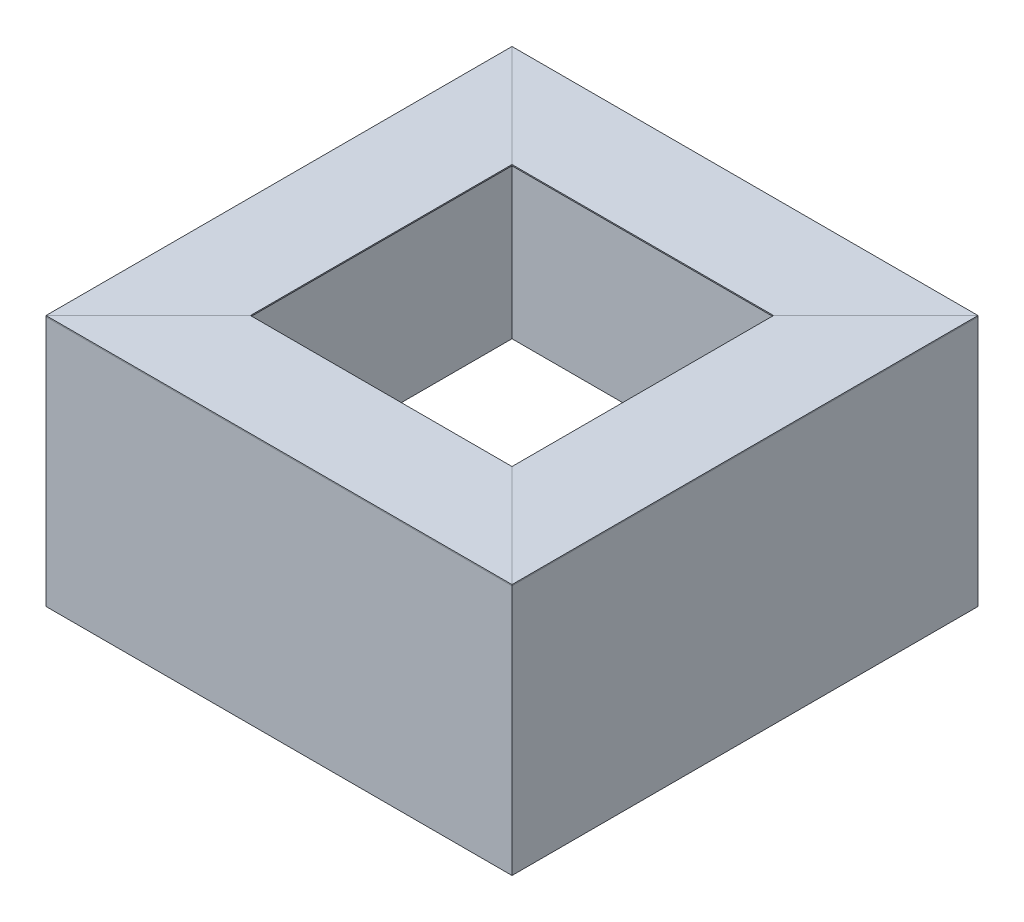
ISO-10303-21;
HEADER;
FILE_DESCRIPTION(('STEP AP214'),'2;1');
FILE_NAME('part.step','',(''),(''),'','','');
FILE_SCHEMA(('AUTOMOTIVE_DESIGN { 1 0 10303 214 1 1 1 1 }'));
ENDSEC;
DATA;
#1=APPLICATION_CONTEXT('core data for automotive mechanical design processes');
#2=APPLICATION_PROTOCOL_DEFINITION('international standard','automotive_design',2000,#1);
#3=PRODUCT_CONTEXT('',#1,'mechanical');
#4=PRODUCT('Part','Part','',(#3));
#5=PRODUCT_RELATED_PRODUCT_CATEGORY('part','',(#4));
#6=PRODUCT_DEFINITION_FORMATION('','',#4);
#7=PRODUCT_DEFINITION_CONTEXT('part definition',#1,'design');
#8=PRODUCT_DEFINITION('design','',#6,#7);
#9=PRODUCT_DEFINITION_SHAPE('','',#8);
#10=(LENGTH_UNIT() NAMED_UNIT(*) SI_UNIT(.MILLI.,.METRE.));
#11=(NAMED_UNIT(*) PLANE_ANGLE_UNIT() SI_UNIT($,.RADIAN.));
#12=(NAMED_UNIT(*) SI_UNIT($,.STERADIAN.) SOLID_ANGLE_UNIT());
#13=UNCERTAINTY_MEASURE_WITH_UNIT(LENGTH_MEASURE(1.E-05),#10,'distance_accuracy_value','');
#14=(GEOMETRIC_REPRESENTATION_CONTEXT(3) GLOBAL_UNCERTAINTY_ASSIGNED_CONTEXT((#13)) GLOBAL_UNIT_ASSIGNED_CONTEXT((#10,
#11,#12)) REPRESENTATION_CONTEXT('',''));
#15=CARTESIAN_POINT('',(0.,0.,0.));
#16=DIRECTION('',(0.,0.,1.));
#17=DIRECTION('',(1.,0.,0.));
#18=AXIS2_PLACEMENT_3D('',#15,#16,#17);
#19=CARTESIAN_POINT('',(189.353415021333,618.40840285693,-50.052741345654));
#20=DIRECTION('',(0.,0.,1.));
#21=DIRECTION('',(1.,0.,0.));
#22=AXIS2_PLACEMENT_3D('',#19,#20,#21);
#23=PLANE('',#22);
#24=DIRECTION('',(1.,0.,0.));
#25=VECTOR('',#24,1.);
#26=CARTESIAN_POINT('',(4.35341502133302,717.787955627811,-50.052741345654));
#27=LINE('',#26,#25);
#28=CARTESIAN_POINT('',(5.10541502133299,717.787955627811,-50.052741345654));
#29=VERTEX_POINT('',#28);
#30=CARTESIAN_POINT('',(374.353415021333,717.787955627811,-50.052741345654));
#31=VERTEX_POINT('',#30);
#32=EDGE_CURVE('E120',#29,#31,#27,.T.);
#33=ORIENTED_EDGE('',*,*,#32,.F.);
#34=DIRECTION('',(0.,-1.,0.));
#35=VECTOR('',#34,1.);
#36=CARTESIAN_POINT('',(5.10541502133299,618.40840285693,-50.052741345654));
#37=LINE('',#36,#35);
#38=CARTESIAN_POINT('',(5.10541502133299,519.028850086049,-50.052741345654));
#39=VERTEX_POINT('',#38);
#40=EDGE_CURVE('E59',#29,#39,#37,.T.);
#41=ORIENTED_EDGE('',*,*,#40,.T.);
#42=DIRECTION('',(-1.,0.,0.));
#43=VECTOR('',#42,1.);
#44=CARTESIAN_POINT('',(374.353415021333,519.028850086049,-50.052741345654));
#45=LINE('',#44,#43);
#46=CARTESIAN_POINT('',(374.353415021333,519.028850086049,-50.052741345654));
#47=VERTEX_POINT('',#46);
#48=EDGE_CURVE('E147',#47,#39,#45,.T.);
#49=ORIENTED_EDGE('',*,*,#48,.F.);
#50=DIRECTION('',(0.,1.,0.));
#51=VECTOR('',#50,1.);
#52=CARTESIAN_POINT('',(374.353415021333,618.40840285693,-50.052741345654));
#53=LINE('',#52,#51);
#54=EDGE_CURVE('E12',#47,#31,#53,.T.);
#55=ORIENTED_EDGE('',*,*,#54,.T.);
#56=EDGE_LOOP('',(#33,#41,#49,#55));
#57=FACE_BOUND('',#56,.T.);
#58=ADVANCED_FACE('F49',(#57),#23,.T.);
#59=CARTESIAN_POINT('',(5.108415021333,717.787955627811,-50.965741345654));
#60=DIRECTION('',(0.,0.,-1.));
#61=DIRECTION('',(0.,1.,0.));
#62=AXIS2_PLACEMENT_3D('',#59,#60,#61);
#63=PLANE('',#62);
#64=DIRECTION('',(0.,-1.,0.));
#65=VECTOR('',#64,1.);
#66=CARTESIAN_POINT('',(373.440415021333,668.098179242371,-50.965741345654));
#67=LINE('',#66,#65);
#68=CARTESIAN_POINT('',(373.440415021333,717.787955627811,-50.965741345654));
#69=VERTEX_POINT('',#68);
#70=CARTESIAN_POINT('',(373.440415021333,519.028850086049,-50.965741345654));
#71=VERTEX_POINT('',#70);
#72=EDGE_CURVE('E149',#69,#71,#67,.T.);
#73=ORIENTED_EDGE('',*,*,#72,.T.);
#74=DIRECTION('',(-1.,0.,0.));
#75=VECTOR('',#74,1.);
#76=CARTESIAN_POINT('',(5.108415021333,519.028850086049,-50.965741345654));
#77=LINE('',#76,#75);
#78=CARTESIAN_POINT('',(6.01841502133302,519.028850086049,-50.965741345654));
#79=VERTEX_POINT('',#78);
#80=EDGE_CURVE('E124',#71,#79,#77,.T.);
#81=ORIENTED_EDGE('',*,*,#80,.T.);
#82=DIRECTION('',(0.,-1.,0.));
#83=VECTOR('',#82,1.);
#84=CARTESIAN_POINT('',(6.01841502133302,668.098179242371,-50.965741345654));
#85=LINE('',#84,#83);
#86=CARTESIAN_POINT('',(6.01841502133302,717.787955627811,-50.965741345654));
#87=VERTEX_POINT('',#86);
#88=EDGE_CURVE('E123',#87,#79,#85,.T.);
#89=ORIENTED_EDGE('',*,*,#88,.F.);
#90=DIRECTION('',(-1.,0.,0.));
#91=VECTOR('',#90,1.);
#92=CARTESIAN_POINT('',(5.108415021333,717.787955627811,-50.965741345654));
#93=LINE('',#92,#91);
#94=EDGE_CURVE('E108',#69,#87,#93,.T.);
#95=ORIENTED_EDGE('',*,*,#94,.F.);
#96=EDGE_LOOP('',(#73,#81,#89,#95));
#97=FACE_BOUND('',#96,.T.);
#98=ADVANCED_FACE('F51',(#97),#63,.T.);
#99=CARTESIAN_POINT('',(374.353415021333,717.787955627811,-50.052741345653));
#100=DIRECTION('',(1.,0.,0.));
#101=DIRECTION('',(0.,-1.,0.));
#102=AXIS2_PLACEMENT_3D('',#99,#100,#101);
#103=PLANE('',#102);
#104=DIRECTION('',(0.,0.,-1.));
#105=VECTOR('',#104,1.);
#106=CARTESIAN_POINT('',(374.353415021333,519.028850086049,-50.052741345654));
#107=LINE('',#106,#105);
#108=CARTESIAN_POINT('',(374.353415021333,519.028850086049,-419.300741345654));
#109=VERTEX_POINT('',#108);
#110=EDGE_CURVE('E141',#47,#109,#107,.T.);
#111=ORIENTED_EDGE('',*,*,#110,.T.);
#112=DIRECTION('',(0.,1.,0.));
#113=VECTOR('',#112,1.);
#114=CARTESIAN_POINT('',(374.353415021333,519.028850086049,-419.300741345654));
#115=LINE('',#114,#113);
#116=CARTESIAN_POINT('',(374.353415021333,717.787955627811,-419.300741345654));
#117=VERTEX_POINT('',#116);
#118=EDGE_CURVE('E133',#109,#117,#115,.T.);
#119=ORIENTED_EDGE('',*,*,#118,.T.);
#120=DIRECTION('',(0.,0.,-1.));
#121=VECTOR('',#120,1.);
#122=CARTESIAN_POINT('',(374.353415021333,717.787955627811,-50.052741345653));
#123=LINE('',#122,#121);
#124=EDGE_CURVE('E154',#31,#117,#123,.T.);
#125=ORIENTED_EDGE('',*,*,#124,.F.);
#126=ORIENTED_EDGE('',*,*,#54,.F.);
#127=EDGE_LOOP('',(#111,#119,#125,#126));
#128=FACE_BOUND('',#127,.T.);
#129=ADVANCED_FACE('F203',(#128),#103,.T.);
#130=CARTESIAN_POINT('',(5.10541502133299,618.40840285693,-234.675741345654));
#131=DIRECTION('',(-1.,0.,0.));
#132=DIRECTION('',(0.,0.,1.));
#133=AXIS2_PLACEMENT_3D('',#130,#131,#132);
#134=PLANE('',#133);
#135=DIRECTION('',(0.,0.,-1.));
#136=VECTOR('',#135,1.);
#137=CARTESIAN_POINT('',(5.10541502133299,519.028850086049,-419.299741345654));
#138=LINE('',#137,#136);
#139=CARTESIAN_POINT('',(5.10541502133299,519.028850086049,-419.300741345654));
#140=VERTEX_POINT('',#139);
#141=EDGE_CURVE('E146',#39,#140,#138,.T.);
#142=ORIENTED_EDGE('',*,*,#141,.F.);
#143=ORIENTED_EDGE('',*,*,#40,.F.);
#144=DIRECTION('',(0.,0.,1.));
#145=VECTOR('',#144,1.);
#146=CARTESIAN_POINT('',(5.10541502133299,717.787955627811,-50.053741345654));
#147=LINE('',#146,#145);
#148=CARTESIAN_POINT('',(5.10541502133299,717.787955627811,-419.300741345654));
#149=VERTEX_POINT('',#148);
#150=EDGE_CURVE('E155',#149,#29,#147,.T.);
#151=ORIENTED_EDGE('',*,*,#150,.F.);
#152=DIRECTION('',(0.,1.,0.));
#153=VECTOR('',#152,1.);
#154=CARTESIAN_POINT('',(5.10541502133299,618.40840285693,-419.300741345654));
#155=LINE('',#154,#153);
#156=EDGE_CURVE('E153',#140,#149,#155,.T.);
#157=ORIENTED_EDGE('',*,*,#156,.F.);
#158=EDGE_LOOP('',(#142,#143,#151,#157));
#159=FACE_BOUND('',#158,.T.);
#160=ADVANCED_FACE('F209',(#159),#134,.T.);
#161=CARTESIAN_POINT('',(5.10541502133299,717.787955627811,-419.675741345654));
#162=DIRECTION('',(0.,1.,0.));
#163=DIRECTION('',(0.,0.,-1.));
#164=AXIS2_PLACEMENT_3D('',#161,#162,#163);
#165=PLANE('',#164);
#166=ORIENTED_EDGE('',*,*,#94,.T.);
#167=DIRECTION('',(0.,0.,1.));
#168=VECTOR('',#167,1.);
#169=CARTESIAN_POINT('',(6.01841502133302,717.787955627811,-419.675741345654));
#170=LINE('',#169,#168);
#171=CARTESIAN_POINT('',(6.01841502133302,717.787955627811,-418.387741345654));
#172=VERTEX_POINT('',#171);
#173=EDGE_CURVE('E113',#172,#87,#170,.T.);
#174=ORIENTED_EDGE('',*,*,#173,.F.);
#175=DIRECTION('',(-1.,0.,0.));
#176=VECTOR('',#175,1.);
#177=CARTESIAN_POINT('',(5.10641502133299,717.787955627811,-418.387741345654));
#178=LINE('',#177,#176);
#179=CARTESIAN_POINT('',(373.440415021333,717.787955627811,-418.387741345654));
#180=VERTEX_POINT('',#179);
#181=EDGE_CURVE('E166',#180,#172,#178,.T.);
#182=ORIENTED_EDGE('',*,*,#181,.F.);
#183=DIRECTION('',(0.,0.,-1.));
#184=VECTOR('',#183,1.);
#185=CARTESIAN_POINT('',(373.440415021333,717.787955627811,-49.675741345654));
#186=LINE('',#185,#184);
#187=EDGE_CURVE('E116',#69,#180,#186,.T.);
#188=ORIENTED_EDGE('',*,*,#187,.F.);
#189=EDGE_LOOP('',(#166,#174,#182,#188));
#190=FACE_BOUND('',#189,.T.);
#191=ORIENTED_EDGE('',*,*,#124,.T.);
#192=DIRECTION('',(-1.,0.,0.));
#193=VECTOR('',#192,1.);
#194=CARTESIAN_POINT('',(374.353415021333,717.787955627811,-419.300741345654));
#195=LINE('',#194,#193);
#196=EDGE_CURVE('E136',#117,#149,#195,.T.);
#197=ORIENTED_EDGE('',*,*,#196,.T.);
#198=ORIENTED_EDGE('',*,*,#150,.T.);
#199=ORIENTED_EDGE('',*,*,#32,.T.);
#200=EDGE_LOOP('',(#191,#197,#198,#199));
#201=FACE_BOUND('',#200,.T.);
#202=ADVANCED_FACE('F110',(#190,#201),#165,.T.);
#203=CARTESIAN_POINT('',(5.10541502133299,519.028850086049,-49.675741345654));
#204=DIRECTION('',(0.,-1.,0.));
#205=DIRECTION('',(0.,0.,-1.));
#206=AXIS2_PLACEMENT_3D('',#203,#204,#205);
#207=PLANE('',#206);
#208=DIRECTION('',(0.,0.,1.));
#209=VECTOR('',#208,1.);
#210=CARTESIAN_POINT('',(373.440415021333,519.028850086049,-419.675741345654));
#211=LINE('',#210,#209);
#212=CARTESIAN_POINT('',(373.440415021333,519.028850086049,-418.387741345654));
#213=VERTEX_POINT('',#212);
#214=EDGE_CURVE('E145',#213,#71,#211,.T.);
#215=ORIENTED_EDGE('',*,*,#214,.F.);
#216=DIRECTION('',(-1.,0.,0.));
#217=VECTOR('',#216,1.);
#218=CARTESIAN_POINT('',(5.10641502133299,519.028850086049,-418.387741345654));
#219=LINE('',#218,#217);
#220=CARTESIAN_POINT('',(6.01841502133302,519.028850086049,-418.387741345654));
#221=VERTEX_POINT('',#220);
#222=EDGE_CURVE('E53',#213,#221,#219,.T.);
#223=ORIENTED_EDGE('',*,*,#222,.T.);
#224=DIRECTION('',(0.,0.,-1.));
#225=VECTOR('',#224,1.);
#226=CARTESIAN_POINT('',(6.01841502133302,519.028850086049,-49.675741345654));
#227=LINE('',#226,#225);
#228=EDGE_CURVE('E127',#79,#221,#227,.T.);
#229=ORIENTED_EDGE('',*,*,#228,.F.);
#230=ORIENTED_EDGE('',*,*,#80,.F.);
#231=EDGE_LOOP('',(#215,#223,#229,#230));
#232=FACE_BOUND('',#231,.T.);
#233=ORIENTED_EDGE('',*,*,#110,.F.);
#234=ORIENTED_EDGE('',*,*,#48,.T.);
#235=ORIENTED_EDGE('',*,*,#141,.T.);
#236=DIRECTION('',(1.,0.,0.));
#237=VECTOR('',#236,1.);
#238=CARTESIAN_POINT('',(4.35341502133302,519.028850086049,-419.300741345654));
#239=LINE('',#238,#237);
#240=EDGE_CURVE('E164',#140,#109,#239,.T.);
#241=ORIENTED_EDGE('',*,*,#240,.T.);
#242=EDGE_LOOP('',(#233,#234,#235,#241));
#243=FACE_BOUND('',#242,.T.);
#244=ADVANCED_FACE('F180',(#232,#243),#207,.T.);
#245=CARTESIAN_POINT('',(6.01841502133302,618.40840285693,-234.675741345654));
#246=DIRECTION('',(1.,0.,0.));
#247=DIRECTION('',(0.,0.,1.));
#248=AXIS2_PLACEMENT_3D('',#245,#246,#247);
#249=PLANE('',#248);
#250=DIRECTION('',(0.,1.,0.));
#251=VECTOR('',#250,1.);
#252=CARTESIAN_POINT('',(6.01841502133302,568.718626471489,-418.387741345654));
#253=LINE('',#252,#251);
#254=EDGE_CURVE('E132',#221,#172,#253,.T.);
#255=ORIENTED_EDGE('',*,*,#254,.T.);
#256=ORIENTED_EDGE('',*,*,#173,.T.);
#257=ORIENTED_EDGE('',*,*,#88,.T.);
#258=ORIENTED_EDGE('',*,*,#228,.T.);
#259=EDGE_LOOP('',(#255,#256,#257,#258));
#260=FACE_BOUND('',#259,.T.);
#261=ADVANCED_FACE('F130',(#260),#249,.T.);
#262=CARTESIAN_POINT('',(189.353415021333,618.40840285693,-419.300741345654));
#263=DIRECTION('',(0.,0.,-1.));
#264=DIRECTION('',(0.,1.,0.));
#265=AXIS2_PLACEMENT_3D('',#262,#263,#264);
#266=PLANE('',#265);
#267=ORIENTED_EDGE('',*,*,#240,.F.);
#268=ORIENTED_EDGE('',*,*,#156,.T.);
#269=ORIENTED_EDGE('',*,*,#196,.F.);
#270=ORIENTED_EDGE('',*,*,#118,.F.);
#271=EDGE_LOOP('',(#267,#268,#269,#270));
#272=FACE_BOUND('',#271,.T.);
#273=ADVANCED_FACE('F186',(#272),#266,.T.);
#274=CARTESIAN_POINT('',(5.10641502133299,519.028850086049,-418.387741345654));
#275=DIRECTION('',(0.,0.,1.));
#276=DIRECTION('',(0.,1.,0.));
#277=AXIS2_PLACEMENT_3D('',#274,#275,#276);
#278=PLANE('',#277);
#279=ORIENTED_EDGE('',*,*,#254,.F.);
#280=ORIENTED_EDGE('',*,*,#222,.F.);
#281=DIRECTION('',(0.,1.,0.));
#282=VECTOR('',#281,1.);
#283=CARTESIAN_POINT('',(373.440415021333,568.718626471489,-418.387741345654));
#284=LINE('',#283,#282);
#285=EDGE_CURVE('E142',#213,#180,#284,.T.);
#286=ORIENTED_EDGE('',*,*,#285,.T.);
#287=ORIENTED_EDGE('',*,*,#181,.T.);
#288=EDGE_LOOP('',(#279,#280,#286,#287));
#289=FACE_BOUND('',#288,.T.);
#290=ADVANCED_FACE('F183',(#289),#278,.T.);
#291=CARTESIAN_POINT('',(373.440415021333,618.40840285693,-234.675741345654));
#292=DIRECTION('',(-1.,0.,0.));
#293=DIRECTION('',(0.,-1.,0.));
#294=AXIS2_PLACEMENT_3D('',#291,#292,#293);
#295=PLANE('',#294);
#296=ORIENTED_EDGE('',*,*,#72,.F.);
#297=ORIENTED_EDGE('',*,*,#187,.T.);
#298=ORIENTED_EDGE('',*,*,#285,.F.);
#299=ORIENTED_EDGE('',*,*,#214,.T.);
#300=EDGE_LOOP('',(#296,#297,#298,#299));
#301=FACE_BOUND('',#300,.T.);
#302=ADVANCED_FACE('F185',(#301),#295,.T.);
#303=CLOSED_SHELL('',(#58,#98,#129,#160,#202,#244,#261,#273,#290,#302));
#304=MANIFOLD_SOLID_BREP('B2',#303);
#305=CARTESIAN_POINT('',(189.729415021334,717.787955627811,-378.800741345652));
#306=DIRECTION('',(0.,-1.,0.));
#307=DIRECTION('',(0.,0.,1.));
#308=AXIS2_PLACEMENT_3D('',#305,#306,#307);
#309=PLANE('',#308);
#310=DIRECTION('',(1.,0.,0.));
#311=VECTOR('',#310,1.);
#312=CARTESIAN_POINT('',(374.353415021334,717.787955627811,-419.300741345652));
#313=LINE('',#312,#311);
#314=CARTESIAN_POINT('',(5.10541502133399,717.787955627811,-419.300741345652));
#315=VERTEX_POINT('',#314);
#316=CARTESIAN_POINT('',(374.353415021334,717.787955627811,-419.300741345652));
#317=VERTEX_POINT('',#316);
#318=EDGE_CURVE('E47',#315,#317,#313,.T.);
#319=ORIENTED_EDGE('',*,*,#318,.T.);
#320=DIRECTION('',(-0.707106781186548,0.,0.707106781186548));
#321=VECTOR('',#320,1.);
#322=CARTESIAN_POINT('',(374.353415021334,717.787955627811,-419.300741345652));
#323=LINE('',#322,#321);
#324=CARTESIAN_POINT('',(293.353415021334,717.787955627811,-338.300741345652));
#325=VERTEX_POINT('',#324);
#326=EDGE_CURVE('E353',#317,#325,#323,.T.);
#327=ORIENTED_EDGE('',*,*,#326,.T.);
#328=DIRECTION('',(-1.,0.,0.));
#329=VECTOR('',#328,1.);
#330=CARTESIAN_POINT('',(86.105415021334,717.787955627811,-338.300741345652));
#331=LINE('',#330,#329);
#332=CARTESIAN_POINT('',(86.105415021334,717.787955627811,-338.300741345652));
#333=VERTEX_POINT('',#332);
#334=EDGE_CURVE('E292',#325,#333,#331,.T.);
#335=ORIENTED_EDGE('',*,*,#334,.T.);
#336=DIRECTION('',(-0.707106781186548,0.,-0.707106781186547));
#337=VECTOR('',#336,1.);
#338=CARTESIAN_POINT('',(5.10541502133399,717.787955627811,-419.300741345652));
#339=LINE('',#338,#337);
#340=EDGE_CURVE('E343',#333,#315,#339,.T.);
#341=ORIENTED_EDGE('',*,*,#340,.T.);
#342=EDGE_LOOP('',(#319,#327,#335,#341));
#343=FACE_BOUND('',#342,.T.);
#344=ADVANCED_FACE('F288',(#343),#309,.T.);
#345=CARTESIAN_POINT('',(189.729415021334,718.700955627811,-378.800741345652));
#346=DIRECTION('',(0.,1.,0.));
#347=DIRECTION('',(-1.,0.,0.));
#348=AXIS2_PLACEMENT_3D('',#345,#346,#347);
#349=PLANE('',#348);
#350=DIRECTION('',(-1.,0.,0.));
#351=VECTOR('',#350,1.);
#352=CARTESIAN_POINT('',(374.353415021334,718.700955627811,-419.300741345652));
#353=LINE('',#352,#351);
#354=CARTESIAN_POINT('',(374.353415021334,718.700955627811,-419.300741345652));
#355=VERTEX_POINT('',#354);
#356=CARTESIAN_POINT('',(5.10541502133399,718.700955627811,-419.300741345652));
#357=VERTEX_POINT('',#356);
#358=EDGE_CURVE('E298',#355,#357,#353,.T.);
#359=ORIENTED_EDGE('',*,*,#358,.T.);
#360=DIRECTION('',(0.707106781186548,0.,0.707106781186547));
#361=VECTOR('',#360,1.);
#362=CARTESIAN_POINT('',(5.10541502133399,718.700955627811,-419.300741345652));
#363=LINE('',#362,#361);
#364=CARTESIAN_POINT('',(86.105415021334,718.700955627811,-338.300741345652));
#365=VERTEX_POINT('',#364);
#366=EDGE_CURVE('E342',#357,#365,#363,.T.);
#367=ORIENTED_EDGE('',*,*,#366,.T.);
#368=DIRECTION('',(1.,0.,0.));
#369=VECTOR('',#368,1.);
#370=CARTESIAN_POINT('',(86.105415021334,718.700955627811,-338.300741345652));
#371=LINE('',#370,#369);
#372=CARTESIAN_POINT('',(293.353415021334,718.700955627811,-338.300741345652));
#373=VERTEX_POINT('',#372);
#374=EDGE_CURVE('E327',#365,#373,#371,.T.);
#375=ORIENTED_EDGE('',*,*,#374,.T.);
#376=DIRECTION('',(-0.707106781186548,0.,0.707106781186548));
#377=VECTOR('',#376,1.);
#378=CARTESIAN_POINT('',(374.353415021334,718.700955627811,-419.300741345652));
#379=LINE('',#378,#377);
#380=EDGE_CURVE('E351',#355,#373,#379,.T.);
#381=ORIENTED_EDGE('',*,*,#380,.F.);
#382=EDGE_LOOP('',(#359,#367,#375,#381));
#383=FACE_BOUND('',#382,.T.);
#384=ADVANCED_FACE('F345',(#383),#349,.T.);
#385=CARTESIAN_POINT('',(5.10541502133399,718.700955627811,-419.300741345652));
#386=DIRECTION('',(0.,0.,-1.));
#387=DIRECTION('',(-1.,0.,0.));
#388=AXIS2_PLACEMENT_3D('',#385,#386,#387);
#389=PLANE('',#388);
#390=ORIENTED_EDGE('',*,*,#358,.F.);
#391=DIRECTION('',(0.,-1.,0.));
#392=VECTOR('',#391,1.);
#393=CARTESIAN_POINT('',(374.353415021334,718.700955627811,-419.300741345652));
#394=LINE('',#393,#392);
#395=EDGE_CURVE('E355',#355,#317,#394,.T.);
#396=ORIENTED_EDGE('',*,*,#395,.T.);
#397=ORIENTED_EDGE('',*,*,#318,.F.);
#398=DIRECTION('',(0.,-1.,0.));
#399=VECTOR('',#398,1.);
#400=CARTESIAN_POINT('',(5.10541502133399,718.700955627811,-419.300741345652));
#401=LINE('',#400,#399);
#402=EDGE_CURVE('E346',#357,#315,#401,.T.);
#403=ORIENTED_EDGE('',*,*,#402,.F.);
#404=EDGE_LOOP('',(#390,#396,#397,#403));
#405=FACE_BOUND('',#404,.T.);
#406=ADVANCED_FACE('F360',(#405),#389,.T.);
#407=CARTESIAN_POINT('',(374.353415021334,718.700955627811,-419.300741345652));
#408=DIRECTION('',(0.707106781186548,0.,0.707106781186548));
#409=DIRECTION('',(0.707106781186548,0.,-0.707106781186548));
#410=AXIS2_PLACEMENT_3D('',#407,#408,#409);
#411=PLANE('',#410);
#412=ORIENTED_EDGE('',*,*,#380,.T.);
#413=DIRECTION('',(0.,-1.,0.));
#414=VECTOR('',#413,1.);
#415=CARTESIAN_POINT('',(293.353415021334,718.700955627811,-338.300741345652));
#416=LINE('',#415,#414);
#417=EDGE_CURVE('E334',#373,#325,#416,.T.);
#418=ORIENTED_EDGE('',*,*,#417,.T.);
#419=ORIENTED_EDGE('',*,*,#326,.F.);
#420=ORIENTED_EDGE('',*,*,#395,.F.);
#421=EDGE_LOOP('',(#412,#418,#419,#420));
#422=FACE_BOUND('',#421,.T.);
#423=ADVANCED_FACE('F362',(#422),#411,.T.);
#424=CARTESIAN_POINT('',(293.353415021334,718.700955627811,-338.300741345652));
#425=DIRECTION('',(0.,0.,1.));
#426=DIRECTION('',(0.,-1.,0.));
#427=AXIS2_PLACEMENT_3D('',#424,#425,#426);
#428=PLANE('',#427);
#429=ORIENTED_EDGE('',*,*,#374,.F.);
#430=DIRECTION('',(0.,-1.,0.));
#431=VECTOR('',#430,1.);
#432=CARTESIAN_POINT('',(86.105415021334,718.700955627811,-338.300741345652));
#433=LINE('',#432,#431);
#434=EDGE_CURVE('E331',#365,#333,#433,.T.);
#435=ORIENTED_EDGE('',*,*,#434,.T.);
#436=ORIENTED_EDGE('',*,*,#334,.F.);
#437=ORIENTED_EDGE('',*,*,#417,.F.);
#438=EDGE_LOOP('',(#429,#435,#436,#437));
#439=FACE_BOUND('',#438,.T.);
#440=ADVANCED_FACE('F329',(#439),#428,.T.);
#441=CARTESIAN_POINT('',(86.105415021334,718.700955627811,-338.300741345652));
#442=DIRECTION('',(-0.707106781186547,0.,0.707106781186548));
#443=DIRECTION('',(0.,-1.,0.));
#444=AXIS2_PLACEMENT_3D('',#441,#442,#443);
#445=PLANE('',#444);
#446=ORIENTED_EDGE('',*,*,#366,.F.);
#447=ORIENTED_EDGE('',*,*,#402,.T.);
#448=ORIENTED_EDGE('',*,*,#340,.F.);
#449=ORIENTED_EDGE('',*,*,#434,.F.);
#450=EDGE_LOOP('',(#446,#447,#448,#449));
#451=FACE_BOUND('',#450,.T.);
#452=ADVANCED_FACE('F290',(#451),#445,.T.);
#453=CLOSED_SHELL('',(#344,#384,#406,#423,#440,#452));
#454=MANIFOLD_SOLID_BREP('B6',#453);
#455=CARTESIAN_POINT('',(45.605415021333,718.700955627811,-234.676741345654));
#456=DIRECTION('',(0.,1.,0.));
#457=DIRECTION('',(1.,0.,0.));
#458=AXIS2_PLACEMENT_3D('',#455,#456,#457);
#459=PLANE('',#458);
#460=DIRECTION('',(0.,0.,1.));
#461=VECTOR('',#460,1.);
#462=CARTESIAN_POINT('',(5.105415021333,718.700955627811,-50.052741345654));
#463=LINE('',#462,#461);
#464=CARTESIAN_POINT('',(5.105415021333,718.700955627811,-419.300741345654));
#465=VERTEX_POINT('',#464);
#466=CARTESIAN_POINT('',(5.105415021333,718.700955627811,-50.052741345654));
#467=VERTEX_POINT('',#466);
#468=EDGE_CURVE('E286',#465,#467,#463,.T.);
#469=ORIENTED_EDGE('',*,*,#468,.T.);
#470=DIRECTION('',(0.707106781186548,0.,-0.707106781186548));
#471=VECTOR('',#470,1.);
#472=CARTESIAN_POINT('',(5.105415021333,718.700955627811,-50.052741345654));
#473=LINE('',#472,#471);
#474=CARTESIAN_POINT('',(86.105415021333,718.700955627811,-131.052741345654));
#475=VERTEX_POINT('',#474);
#476=EDGE_CURVE('E486',#467,#475,#473,.T.);
#477=ORIENTED_EDGE('',*,*,#476,.T.);
#478=DIRECTION('',(0.,0.,-1.));
#479=VECTOR('',#478,1.);
#480=CARTESIAN_POINT('',(86.105415021333,718.700955627811,-338.300741345654));
#481=LINE('',#480,#479);
#482=CARTESIAN_POINT('',(86.105415021333,718.700955627811,-338.300741345654));
#483=VERTEX_POINT('',#482);
#484=EDGE_CURVE('E425',#475,#483,#481,.T.);
#485=ORIENTED_EDGE('',*,*,#484,.T.);
#486=DIRECTION('',(-0.707106781186547,0.,-0.707106781186548));
#487=VECTOR('',#486,1.);
#488=CARTESIAN_POINT('',(5.105415021333,718.700955627811,-419.300741345654));
#489=LINE('',#488,#487);
#490=EDGE_CURVE('E476',#483,#465,#489,.T.);
#491=ORIENTED_EDGE('',*,*,#490,.T.);
#492=EDGE_LOOP('',(#469,#477,#485,#491));
#493=FACE_BOUND('',#492,.T.);
#494=ADVANCED_FACE('F421',(#493),#459,.T.);
#495=CARTESIAN_POINT('',(45.605415021333,717.787955627811,-234.676741345654));
#496=DIRECTION('',(0.,-1.,0.));
#497=DIRECTION('',(0.,0.,-1.));
#498=AXIS2_PLACEMENT_3D('',#495,#496,#497);
#499=PLANE('',#498);
#500=DIRECTION('',(0.,0.,-1.));
#501=VECTOR('',#500,1.);
#502=CARTESIAN_POINT('',(5.105415021333,717.787955627811,-50.052741345654));
#503=LINE('',#502,#501);
#504=CARTESIAN_POINT('',(5.105415021333,717.787955627811,-50.052741345654));
#505=VERTEX_POINT('',#504);
#506=CARTESIAN_POINT('',(5.105415021333,717.787955627811,-419.300741345654));
#507=VERTEX_POINT('',#506);
#508=EDGE_CURVE('E431',#505,#507,#503,.T.);
#509=ORIENTED_EDGE('',*,*,#508,.T.);
#510=DIRECTION('',(0.707106781186547,0.,0.707106781186548));
#511=VECTOR('',#510,1.);
#512=CARTESIAN_POINT('',(5.105415021333,717.787955627811,-419.300741345654));
#513=LINE('',#512,#511);
#514=CARTESIAN_POINT('',(86.105415021333,717.787955627811,-338.300741345654));
#515=VERTEX_POINT('',#514);
#516=EDGE_CURVE('E475',#507,#515,#513,.T.);
#517=ORIENTED_EDGE('',*,*,#516,.T.);
#518=DIRECTION('',(0.,0.,1.));
#519=VECTOR('',#518,1.);
#520=CARTESIAN_POINT('',(86.105415021333,717.787955627811,-338.300741345654));
#521=LINE('',#520,#519);
#522=CARTESIAN_POINT('',(86.105415021333,717.787955627811,-131.052741345654));
#523=VERTEX_POINT('',#522);
#524=EDGE_CURVE('E460',#515,#523,#521,.T.);
#525=ORIENTED_EDGE('',*,*,#524,.T.);
#526=DIRECTION('',(0.707106781186548,0.,-0.707106781186548));
#527=VECTOR('',#526,1.);
#528=CARTESIAN_POINT('',(5.105415021333,717.787955627811,-50.052741345654));
#529=LINE('',#528,#527);
#530=EDGE_CURVE('E484',#505,#523,#529,.T.);
#531=ORIENTED_EDGE('',*,*,#530,.F.);
#532=EDGE_LOOP('',(#509,#517,#525,#531));
#533=FACE_BOUND('',#532,.T.);
#534=ADVANCED_FACE('F478',(#533),#499,.T.);
#535=CARTESIAN_POINT('',(5.105415021333,717.787955627811,-419.300741345654));
#536=DIRECTION('',(-1.,0.,0.));
#537=DIRECTION('',(0.,0.,-1.));
#538=AXIS2_PLACEMENT_3D('',#535,#536,#537);
#539=PLANE('',#538);
#540=ORIENTED_EDGE('',*,*,#508,.F.);
#541=DIRECTION('',(0.,1.,0.));
#542=VECTOR('',#541,1.);
#543=CARTESIAN_POINT('',(5.105415021333,717.787955627811,-50.052741345654));
#544=LINE('',#543,#542);
#545=EDGE_CURVE('E488',#505,#467,#544,.T.);
#546=ORIENTED_EDGE('',*,*,#545,.T.);
#547=ORIENTED_EDGE('',*,*,#468,.F.);
#548=DIRECTION('',(0.,1.,0.));
#549=VECTOR('',#548,1.);
#550=CARTESIAN_POINT('',(5.105415021333,717.787955627811,-419.300741345654));
#551=LINE('',#550,#549);
#552=EDGE_CURVE('E479',#507,#465,#551,.T.);
#553=ORIENTED_EDGE('',*,*,#552,.F.);
#554=EDGE_LOOP('',(#540,#546,#547,#553));
#555=FACE_BOUND('',#554,.T.);
#556=ADVANCED_FACE('F493',(#555),#539,.T.);
#557=CARTESIAN_POINT('',(5.105415021333,717.787955627811,-50.052741345654));
#558=DIRECTION('',(0.707106781186548,0.,0.707106781186548));
#559=DIRECTION('',(-0.707106781186548,0.,0.707106781186548));
#560=AXIS2_PLACEMENT_3D('',#557,#558,#559);
#561=PLANE('',#560);
#562=ORIENTED_EDGE('',*,*,#530,.T.);
#563=DIRECTION('',(0.,1.,0.));
#564=VECTOR('',#563,1.);
#565=CARTESIAN_POINT('',(86.105415021333,717.787955627811,-131.052741345654));
#566=LINE('',#565,#564);
#567=EDGE_CURVE('E467',#523,#475,#566,.T.);
#568=ORIENTED_EDGE('',*,*,#567,.T.);
#569=ORIENTED_EDGE('',*,*,#476,.F.);
#570=ORIENTED_EDGE('',*,*,#545,.F.);
#571=EDGE_LOOP('',(#562,#568,#569,#570));
#572=FACE_BOUND('',#571,.T.);
#573=ADVANCED_FACE('F495',(#572),#561,.T.);
#574=CARTESIAN_POINT('',(86.105415021333,717.787955627811,-131.052741345654));
#575=DIRECTION('',(1.,0.,0.));
#576=DIRECTION('',(0.,1.,0.));
#577=AXIS2_PLACEMENT_3D('',#574,#575,#576);
#578=PLANE('',#577);
#579=ORIENTED_EDGE('',*,*,#524,.F.);
#580=DIRECTION('',(0.,1.,0.));
#581=VECTOR('',#580,1.);
#582=CARTESIAN_POINT('',(86.105415021333,717.787955627811,-338.300741345654));
#583=LINE('',#582,#581);
#584=EDGE_CURVE('E464',#515,#483,#583,.T.);
#585=ORIENTED_EDGE('',*,*,#584,.T.);
#586=ORIENTED_EDGE('',*,*,#484,.F.);
#587=ORIENTED_EDGE('',*,*,#567,.F.);
#588=EDGE_LOOP('',(#579,#585,#586,#587));
#589=FACE_BOUND('',#588,.T.);
#590=ADVANCED_FACE('F462',(#589),#578,.T.);
#591=CARTESIAN_POINT('',(86.105415021333,717.787955627811,-338.300741345654));
#592=DIRECTION('',(0.707106781186548,0.,-0.707106781186547));
#593=DIRECTION('',(0.,1.,0.));
#594=AXIS2_PLACEMENT_3D('',#591,#592,#593);
#595=PLANE('',#594);
#596=ORIENTED_EDGE('',*,*,#516,.F.);
#597=ORIENTED_EDGE('',*,*,#552,.T.);
#598=ORIENTED_EDGE('',*,*,#490,.F.);
#599=ORIENTED_EDGE('',*,*,#584,.F.);
#600=EDGE_LOOP('',(#596,#597,#598,#599));
#601=FACE_BOUND('',#600,.T.);
#602=ADVANCED_FACE('F423',(#601),#595,.T.);
#603=CLOSED_SHELL('',(#494,#534,#556,#573,#590,#602));
#604=MANIFOLD_SOLID_BREP('B41',#603);
#605=CARTESIAN_POINT('',(189.729415021332,717.787955627811,-90.552741345655));
#606=DIRECTION('',(0.,-1.,0.));
#607=DIRECTION('',(0.,0.,-1.));
#608=AXIS2_PLACEMENT_3D('',#605,#606,#607);
#609=PLANE('',#608);
#610=DIRECTION('',(-1.,0.,0.));
#611=VECTOR('',#610,1.);
#612=CARTESIAN_POINT('',(5.105415021332,717.787955627811,-50.052741345655));
#613=LINE('',#612,#611);
#614=CARTESIAN_POINT('',(374.353415021332,717.787955627811,-50.052741345655));
#615=VERTEX_POINT('',#614);
#616=CARTESIAN_POINT('',(5.105415021332,717.787955627811,-50.052741345655));
#617=VERTEX_POINT('',#616);
#618=EDGE_CURVE('E419',#615,#617,#613,.T.);
#619=ORIENTED_EDGE('',*,*,#618,.T.);
#620=DIRECTION('',(0.707106781186548,0.,-0.707106781186548));
#621=VECTOR('',#620,1.);
#622=CARTESIAN_POINT('',(5.105415021332,717.787955627811,-50.052741345655));
#623=LINE('',#622,#621);
#624=CARTESIAN_POINT('',(86.105415021332,717.787955627811,-131.052741345655));
#625=VERTEX_POINT('',#624);
#626=EDGE_CURVE('E618',#617,#625,#623,.T.);
#627=ORIENTED_EDGE('',*,*,#626,.T.);
#628=DIRECTION('',(1.,0.,0.));
#629=VECTOR('',#628,1.);
#630=CARTESIAN_POINT('',(293.353415021332,717.787955627811,-131.052741345655));
#631=LINE('',#630,#629);
#632=CARTESIAN_POINT('',(293.353415021332,717.787955627811,-131.052741345655));
#633=VERTEX_POINT('',#632);
#634=EDGE_CURVE('E557',#625,#633,#631,.T.);
#635=ORIENTED_EDGE('',*,*,#634,.T.);
#636=DIRECTION('',(0.707106781186548,0.,0.707106781186547));
#637=VECTOR('',#636,1.);
#638=CARTESIAN_POINT('',(374.353415021332,717.787955627811,-50.052741345655));
#639=LINE('',#638,#637);
#640=EDGE_CURVE('E608',#633,#615,#639,.T.);
#641=ORIENTED_EDGE('',*,*,#640,.T.);
#642=EDGE_LOOP('',(#619,#627,#635,#641));
#643=FACE_BOUND('',#642,.T.);
#644=ADVANCED_FACE('F553',(#643),#609,.T.);
#645=CARTESIAN_POINT('',(189.729415021332,718.700955627811,-90.552741345655));
#646=DIRECTION('',(0.,1.,0.));
#647=DIRECTION('',(1.,0.,0.));
#648=AXIS2_PLACEMENT_3D('',#645,#646,#647);
#649=PLANE('',#648);
#650=DIRECTION('',(1.,0.,0.));
#651=VECTOR('',#650,1.);
#652=CARTESIAN_POINT('',(5.105415021332,718.700955627811,-50.052741345655));
#653=LINE('',#652,#651);
#654=CARTESIAN_POINT('',(5.105415021332,718.700955627811,-50.052741345655));
#655=VERTEX_POINT('',#654);
#656=CARTESIAN_POINT('',(374.353415021332,718.700955627811,-50.052741345655));
#657=VERTEX_POINT('',#656);
#658=EDGE_CURVE('E563',#655,#657,#653,.T.);
#659=ORIENTED_EDGE('',*,*,#658,.T.);
#660=DIRECTION('',(-0.707106781186548,0.,-0.707106781186547));
#661=VECTOR('',#660,1.);
#662=CARTESIAN_POINT('',(374.353415021332,718.700955627811,-50.052741345655));
#663=LINE('',#662,#661);
#664=CARTESIAN_POINT('',(293.353415021332,718.700955627811,-131.052741345655));
#665=VERTEX_POINT('',#664);
#666=EDGE_CURVE('E607',#657,#665,#663,.T.);
#667=ORIENTED_EDGE('',*,*,#666,.T.);
#668=DIRECTION('',(-1.,0.,0.));
#669=VECTOR('',#668,1.);
#670=CARTESIAN_POINT('',(293.353415021332,718.700955627811,-131.052741345655));
#671=LINE('',#670,#669);
#672=CARTESIAN_POINT('',(86.105415021332,718.700955627811,-131.052741345655));
#673=VERTEX_POINT('',#672);
#674=EDGE_CURVE('E592',#665,#673,#671,.T.);
#675=ORIENTED_EDGE('',*,*,#674,.T.);
#676=DIRECTION('',(0.707106781186548,0.,-0.707106781186548));
#677=VECTOR('',#676,1.);
#678=CARTESIAN_POINT('',(5.105415021332,718.700955627811,-50.052741345655));
#679=LINE('',#678,#677);
#680=EDGE_CURVE('E616',#655,#673,#679,.T.);
#681=ORIENTED_EDGE('',*,*,#680,.F.);
#682=EDGE_LOOP('',(#659,#667,#675,#681));
#683=FACE_BOUND('',#682,.T.);
#684=ADVANCED_FACE('F610',(#683),#649,.T.);
#685=CARTESIAN_POINT('',(374.353415021332,718.700955627811,-50.052741345655));
#686=DIRECTION('',(0.,0.,1.));
#687=DIRECTION('',(1.,0.,0.));
#688=AXIS2_PLACEMENT_3D('',#685,#686,#687);
#689=PLANE('',#688);
#690=ORIENTED_EDGE('',*,*,#658,.F.);
#691=DIRECTION('',(0.,-1.,0.));
#692=VECTOR('',#691,1.);
#693=CARTESIAN_POINT('',(5.105415021332,718.700955627811,-50.052741345655));
#694=LINE('',#693,#692);
#695=EDGE_CURVE('E620',#655,#617,#694,.T.);
#696=ORIENTED_EDGE('',*,*,#695,.T.);
#697=ORIENTED_EDGE('',*,*,#618,.F.);
#698=DIRECTION('',(0.,-1.,0.));
#699=VECTOR('',#698,1.);
#700=CARTESIAN_POINT('',(374.353415021332,718.700955627811,-50.052741345655));
#701=LINE('',#700,#699);
#702=EDGE_CURVE('E611',#657,#615,#701,.T.);
#703=ORIENTED_EDGE('',*,*,#702,.F.);
#704=EDGE_LOOP('',(#690,#696,#697,#703));
#705=FACE_BOUND('',#704,.T.);
#706=ADVANCED_FACE('F625',(#705),#689,.T.);
#707=CARTESIAN_POINT('',(5.105415021332,718.700955627811,-50.052741345655));
#708=DIRECTION('',(-0.707106781186548,0.,-0.707106781186548));
#709=DIRECTION('',(-0.707106781186548,0.,0.707106781186548));
#710=AXIS2_PLACEMENT_3D('',#707,#708,#709);
#711=PLANE('',#710);
#712=ORIENTED_EDGE('',*,*,#680,.T.);
#713=DIRECTION('',(0.,-1.,0.));
#714=VECTOR('',#713,1.);
#715=CARTESIAN_POINT('',(86.105415021332,718.700955627811,-131.052741345655));
#716=LINE('',#715,#714);
#717=EDGE_CURVE('E599',#673,#625,#716,.T.);
#718=ORIENTED_EDGE('',*,*,#717,.T.);
#719=ORIENTED_EDGE('',*,*,#626,.F.);
#720=ORIENTED_EDGE('',*,*,#695,.F.);
#721=EDGE_LOOP('',(#712,#718,#719,#720));
#722=FACE_BOUND('',#721,.T.);
#723=ADVANCED_FACE('F627',(#722),#711,.T.);
#724=CARTESIAN_POINT('',(86.105415021332,718.700955627811,-131.052741345655));
#725=DIRECTION('',(0.,0.,-1.));
#726=DIRECTION('',(0.,-1.,0.));
#727=AXIS2_PLACEMENT_3D('',#724,#725,#726);
#728=PLANE('',#727);
#729=ORIENTED_EDGE('',*,*,#674,.F.);
#730=DIRECTION('',(0.,-1.,0.));
#731=VECTOR('',#730,1.);
#732=CARTESIAN_POINT('',(293.353415021332,718.700955627811,-131.052741345655));
#733=LINE('',#732,#731);
#734=EDGE_CURVE('E596',#665,#633,#733,.T.);
#735=ORIENTED_EDGE('',*,*,#734,.T.);
#736=ORIENTED_EDGE('',*,*,#634,.F.);
#737=ORIENTED_EDGE('',*,*,#717,.F.);
#738=EDGE_LOOP('',(#729,#735,#736,#737));
#739=FACE_BOUND('',#738,.T.);
#740=ADVANCED_FACE('F594',(#739),#728,.T.);
#741=CARTESIAN_POINT('',(293.353415021332,718.700955627811,-131.052741345655));
#742=DIRECTION('',(0.707106781186547,0.,-0.707106781186548));
#743=DIRECTION('',(0.,-1.,0.));
#744=AXIS2_PLACEMENT_3D('',#741,#742,#743);
#745=PLANE('',#744);
#746=ORIENTED_EDGE('',*,*,#666,.F.);
#747=ORIENTED_EDGE('',*,*,#702,.T.);
#748=ORIENTED_EDGE('',*,*,#640,.F.);
#749=ORIENTED_EDGE('',*,*,#734,.F.);
#750=EDGE_LOOP('',(#746,#747,#748,#749));
#751=FACE_BOUND('',#750,.T.);
#752=ADVANCED_FACE('F555',(#751),#745,.T.);
#753=CLOSED_SHELL('',(#644,#684,#706,#723,#740,#752));
#754=MANIFOLD_SOLID_BREP('B280',#753);
#755=CARTESIAN_POINT('',(333.853415021333,718.700955627811,-234.676741345653));
#756=DIRECTION('',(0.,1.,0.));
#757=DIRECTION('',(-1.,0.,0.));
#758=AXIS2_PLACEMENT_3D('',#755,#756,#757);
#759=PLANE('',#758);
#760=DIRECTION('',(0.,0.,-1.));
#761=VECTOR('',#760,1.);
#762=CARTESIAN_POINT('',(374.353415021333,718.700955627811,-419.300741345653));
#763=LINE('',#762,#761);
#764=CARTESIAN_POINT('',(374.353415021333,718.700955627811,-50.052741345653));
#765=VERTEX_POINT('',#764);
#766=CARTESIAN_POINT('',(374.353415021333,718.700955627811,-419.300741345653));
#767=VERTEX_POINT('',#766);
#768=EDGE_CURVE('E551',#765,#767,#763,.T.);
#769=ORIENTED_EDGE('',*,*,#768,.T.);
#770=DIRECTION('',(-0.707106781186549,0.,0.707106781186547));
#771=VECTOR('',#770,1.);
#772=CARTESIAN_POINT('',(374.353415021333,718.700955627811,-419.300741345653));
#773=LINE('',#772,#771);
#774=CARTESIAN_POINT('',(293.353415021333,718.700955627811,-338.300741345653));
#775=VERTEX_POINT('',#774);
#776=EDGE_CURVE('E741',#767,#775,#773,.T.);
#777=ORIENTED_EDGE('',*,*,#776,.T.);
#778=DIRECTION('',(0.,0.,1.));
#779=VECTOR('',#778,1.);
#780=CARTESIAN_POINT('',(293.353415021333,718.700955627811,-131.052741345653));
#781=LINE('',#780,#779);
#782=CARTESIAN_POINT('',(293.353415021333,718.700955627811,-131.052741345653));
#783=VERTEX_POINT('',#782);
#784=EDGE_CURVE('E680',#775,#783,#781,.T.);
#785=ORIENTED_EDGE('',*,*,#784,.T.);
#786=DIRECTION('',(0.707106781186546,0.,0.707106781186549));
#787=VECTOR('',#786,1.);
#788=CARTESIAN_POINT('',(374.353415021333,718.700955627811,-50.052741345653));
#789=LINE('',#788,#787);
#790=EDGE_CURVE('E731',#783,#765,#789,.T.);
#791=ORIENTED_EDGE('',*,*,#790,.T.);
#792=EDGE_LOOP('',(#769,#777,#785,#791));
#793=FACE_BOUND('',#792,.T.);
#794=ADVANCED_FACE('F676',(#793),#759,.T.);
#795=CARTESIAN_POINT('',(333.853415021333,717.787955627811,-234.676741345653));
#796=DIRECTION('',(0.,-1.,0.));
#797=DIRECTION('',(0.,0.,1.));
#798=AXIS2_PLACEMENT_3D('',#795,#796,#797);
#799=PLANE('',#798);
#800=DIRECTION('',(0.,0.,1.));
#801=VECTOR('',#800,1.);
#802=CARTESIAN_POINT('',(374.353415021333,717.787955627811,-419.300741345653));
#803=LINE('',#802,#801);
#804=CARTESIAN_POINT('',(374.353415021333,717.787955627811,-419.300741345653));
#805=VERTEX_POINT('',#804);
#806=CARTESIAN_POINT('',(374.353415021333,717.787955627811,-50.052741345653));
#807=VERTEX_POINT('',#806);
#808=EDGE_CURVE('E686',#805,#807,#803,.T.);
#809=ORIENTED_EDGE('',*,*,#808,.T.);
#810=DIRECTION('',(-0.707106781186546,0.,-0.707106781186549));
#811=VECTOR('',#810,1.);
#812=CARTESIAN_POINT('',(374.353415021333,717.787955627811,-50.052741345653));
#813=LINE('',#812,#811);
#814=CARTESIAN_POINT('',(293.353415021333,717.787955627811,-131.052741345653));
#815=VERTEX_POINT('',#814);
#816=EDGE_CURVE('E730',#807,#815,#813,.T.);
#817=ORIENTED_EDGE('',*,*,#816,.T.);
#818=DIRECTION('',(0.,0.,-1.));
#819=VECTOR('',#818,1.);
#820=CARTESIAN_POINT('',(293.353415021333,717.787955627811,-131.052741345653));
#821=LINE('',#820,#819);
#822=CARTESIAN_POINT('',(293.353415021333,717.787955627811,-338.300741345653));
#823=VERTEX_POINT('',#822);
#824=EDGE_CURVE('E715',#815,#823,#821,.T.);
#825=ORIENTED_EDGE('',*,*,#824,.T.);
#826=DIRECTION('',(-0.707106781186549,0.,0.707106781186547));
#827=VECTOR('',#826,1.);
#828=CARTESIAN_POINT('',(374.353415021333,717.787955627811,-419.300741345653));
#829=LINE('',#828,#827);
#830=EDGE_CURVE('E739',#805,#823,#829,.T.);
#831=ORIENTED_EDGE('',*,*,#830,.F.);
#832=EDGE_LOOP('',(#809,#817,#825,#831));
#833=FACE_BOUND('',#832,.T.);
#834=ADVANCED_FACE('F733',(#833),#799,.T.);
#835=CARTESIAN_POINT('',(374.353415021333,717.787955627811,-50.052741345653));
#836=DIRECTION('',(1.,0.,0.));
#837=DIRECTION('',(0.,0.,1.));
#838=AXIS2_PLACEMENT_3D('',#835,#836,#837);
#839=PLANE('',#838);
#840=ORIENTED_EDGE('',*,*,#808,.F.);
#841=DIRECTION('',(0.,1.,0.));
#842=VECTOR('',#841,1.);
#843=CARTESIAN_POINT('',(374.353415021333,717.787955627811,-419.300741345653));
#844=LINE('',#843,#842);
#845=EDGE_CURVE('E743',#805,#767,#844,.T.);
#846=ORIENTED_EDGE('',*,*,#845,.T.);
#847=ORIENTED_EDGE('',*,*,#768,.F.);
#848=DIRECTION('',(0.,1.,0.));
#849=VECTOR('',#848,1.);
#850=CARTESIAN_POINT('',(374.353415021333,717.787955627811,-50.052741345653));
#851=LINE('',#850,#849);
#852=EDGE_CURVE('E734',#807,#765,#851,.T.);
#853=ORIENTED_EDGE('',*,*,#852,.F.);
#854=EDGE_LOOP('',(#840,#846,#847,#853));
#855=FACE_BOUND('',#854,.T.);
#856=ADVANCED_FACE('F748',(#855),#839,.T.);
#857=CARTESIAN_POINT('',(374.353415021333,717.787955627811,-419.300741345653));
#858=DIRECTION('',(-0.707106781186547,0.,-0.707106781186549));
#859=DIRECTION('',(0.707106781186549,0.,-0.707106781186547));
#860=AXIS2_PLACEMENT_3D('',#857,#858,#859);
#861=PLANE('',#860);
#862=ORIENTED_EDGE('',*,*,#830,.T.);
#863=DIRECTION('',(0.,1.,0.));
#864=VECTOR('',#863,1.);
#865=CARTESIAN_POINT('',(293.353415021333,717.787955627811,-338.300741345653));
#866=LINE('',#865,#864);
#867=EDGE_CURVE('E722',#823,#775,#866,.T.);
#868=ORIENTED_EDGE('',*,*,#867,.T.);
#869=ORIENTED_EDGE('',*,*,#776,.F.);
#870=ORIENTED_EDGE('',*,*,#845,.F.);
#871=EDGE_LOOP('',(#862,#868,#869,#870));
#872=FACE_BOUND('',#871,.T.);
#873=ADVANCED_FACE('F750',(#872),#861,.T.);
#874=CARTESIAN_POINT('',(293.353415021333,717.787955627811,-338.300741345653));
#875=DIRECTION('',(-1.,0.,0.));
#876=DIRECTION('',(0.,1.,0.));
#877=AXIS2_PLACEMENT_3D('',#874,#875,#876);
#878=PLANE('',#877);
#879=ORIENTED_EDGE('',*,*,#824,.F.);
#880=DIRECTION('',(0.,1.,0.));
#881=VECTOR('',#880,1.);
#882=CARTESIAN_POINT('',(293.353415021333,717.787955627811,-131.052741345653));
#883=LINE('',#882,#881);
#884=EDGE_CURVE('E719',#815,#783,#883,.T.);
#885=ORIENTED_EDGE('',*,*,#884,.T.);
#886=ORIENTED_EDGE('',*,*,#784,.F.);
#887=ORIENTED_EDGE('',*,*,#867,.F.);
#888=EDGE_LOOP('',(#879,#885,#886,#887));
#889=FACE_BOUND('',#888,.T.);
#890=ADVANCED_FACE('F717',(#889),#878,.T.);
#891=CARTESIAN_POINT('',(293.353415021333,717.787955627811,-131.052741345653));
#892=DIRECTION('',(-0.707106781186549,0.,0.707106781186546));
#893=DIRECTION('',(0.,1.,0.));
#894=AXIS2_PLACEMENT_3D('',#891,#892,#893);
#895=PLANE('',#894);
#896=ORIENTED_EDGE('',*,*,#816,.F.);
#897=ORIENTED_EDGE('',*,*,#852,.T.);
#898=ORIENTED_EDGE('',*,*,#790,.F.);
#899=ORIENTED_EDGE('',*,*,#884,.F.);
#900=EDGE_LOOP('',(#896,#897,#898,#899));
#901=FACE_BOUND('',#900,.T.);
#902=ADVANCED_FACE('F678',(#901),#895,.T.);
#903=CLOSED_SHELL('',(#794,#834,#856,#873,#890,#902));
#904=MANIFOLD_SOLID_BREP('B413',#903);
#905=ADVANCED_BREP_SHAPE_REPRESENTATION('',(#18,#304,#454,#604,#754,#904),#14);
#906=SHAPE_DEFINITION_REPRESENTATION(#9,#905);
ENDSEC;
END-ISO-10303-21;
